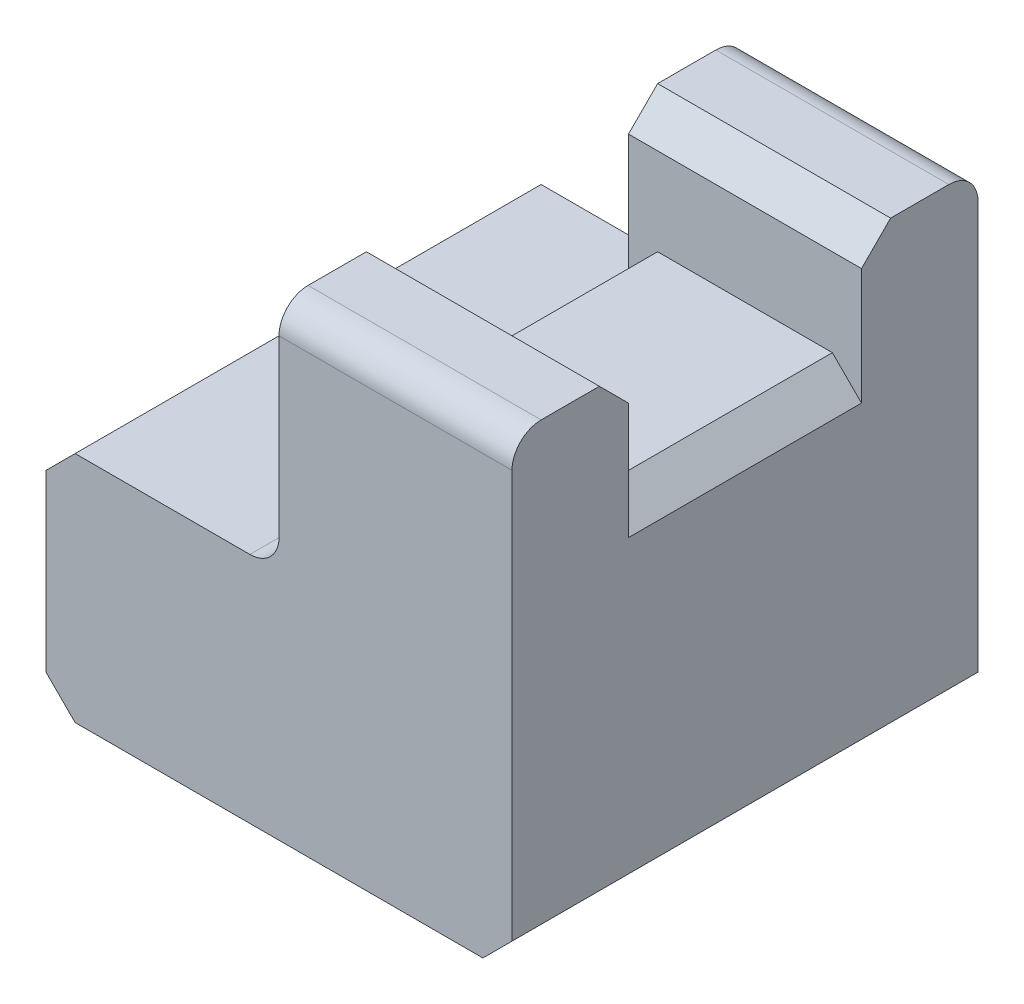
ISO-10303-21;
HEADER;
FILE_DESCRIPTION(('STEP AP214'),'2;1');
FILE_NAME('part.step','',(''),(''),'','','');
FILE_SCHEMA(('AUTOMOTIVE_DESIGN { 1 0 10303 214 1 1 1 1 }'));
ENDSEC;
DATA;
#1=APPLICATION_CONTEXT('core data for automotive mechanical design processes');
#2=APPLICATION_PROTOCOL_DEFINITION('international standard','automotive_design',2000,#1);
#3=PRODUCT_CONTEXT('',#1,'mechanical');
#4=PRODUCT('Part','Part','',(#3));
#5=PRODUCT_RELATED_PRODUCT_CATEGORY('part','',(#4));
#6=PRODUCT_DEFINITION_FORMATION('','',#4);
#7=PRODUCT_DEFINITION_CONTEXT('part definition',#1,'design');
#8=PRODUCT_DEFINITION('design','',#6,#7);
#9=PRODUCT_DEFINITION_SHAPE('','',#8);
#10=(LENGTH_UNIT() NAMED_UNIT(*) SI_UNIT(.MILLI.,.METRE.));
#11=(NAMED_UNIT(*) PLANE_ANGLE_UNIT() SI_UNIT($,.RADIAN.));
#12=(NAMED_UNIT(*) SI_UNIT($,.STERADIAN.) SOLID_ANGLE_UNIT());
#13=UNCERTAINTY_MEASURE_WITH_UNIT(LENGTH_MEASURE(1.E-05),#10,'distance_accuracy_value','');
#14=(GEOMETRIC_REPRESENTATION_CONTEXT(3) GLOBAL_UNCERTAINTY_ASSIGNED_CONTEXT((#13)) GLOBAL_UNIT_ASSIGNED_CONTEXT((#10,
#11,#12)) REPRESENTATION_CONTEXT('',''));
#15=CARTESIAN_POINT('',(0.,0.,0.));
#16=DIRECTION('',(0.,0.,1.));
#17=DIRECTION('',(1.,0.,0.));
#18=AXIS2_PLACEMENT_3D('',#15,#16,#17);
#19=CARTESIAN_POINT('',(-40.,80.,80.));
#20=DIRECTION('',(0.,-1.,0.));
#21=DIRECTION('',(0.,0.,-1.));
#22=AXIS2_PLACEMENT_3D('',#19,#20,#21);
#23=PLANE('',#22);
#24=DIRECTION('',(0.,0.,-1.));
#25=VECTOR('',#24,1.);
#26=CARTESIAN_POINT('',(-40.,80.,80.));
#27=LINE('',#26,#25);
#28=CARTESIAN_POINT('',(-40.,80.,15.));
#29=VERTEX_POINT('',#28);
#30=CARTESIAN_POINT('',(-40.,80.,5.));
#31=VERTEX_POINT('',#30);
#32=EDGE_CURVE('E168',#29,#31,#27,.T.);
#33=ORIENTED_EDGE('',*,*,#32,.F.);
#34=DIRECTION('',(1.,0.,0.));
#35=VECTOR('',#34,1.);
#36=CARTESIAN_POINT('',(-40.,80.,15.));
#37=LINE('',#36,#35);
#38=CARTESIAN_POINT('',(0.,80.,15.));
#39=VERTEX_POINT('',#38);
#40=EDGE_CURVE('E216',#29,#39,#37,.T.);
#41=ORIENTED_EDGE('',*,*,#40,.T.);
#42=DIRECTION('',(0.,0.,-1.));
#43=VECTOR('',#42,1.);
#44=CARTESIAN_POINT('',(0.,80.,80.));
#45=LINE('',#44,#43);
#46=CARTESIAN_POINT('',(0.,80.,5.));
#47=VERTEX_POINT('',#46);
#48=EDGE_CURVE('E196',#39,#47,#45,.T.);
#49=ORIENTED_EDGE('',*,*,#48,.T.);
#50=DIRECTION('',(-1.,0.,0.));
#51=VECTOR('',#50,1.);
#52=CARTESIAN_POINT('',(-40.,80.,5.));
#53=LINE('',#52,#51);
#54=EDGE_CURVE('E190',#47,#31,#53,.T.);
#55=ORIENTED_EDGE('',*,*,#54,.T.);
#56=EDGE_LOOP('',(#33,#41,#49,#55));
#57=FACE_BOUND('',#56,.T.);
#58=ADVANCED_FACE('F33',(#57),#23,.F.);
#59=CARTESIAN_POINT('',(0.,80.,80.));
#60=DIRECTION('',(-1.,0.,0.));
#61=DIRECTION('',(0.,-1.,0.));
#62=AXIS2_PLACEMENT_3D('',#59,#60,#61);
#63=PLANE('',#62);
#64=DIRECTION('',(0.,1.,0.));
#65=VECTOR('',#64,1.);
#66=CARTESIAN_POINT('',(0.,60.,20.));
#67=LINE('',#66,#65);
#68=CARTESIAN_POINT('',(0.,55.,20.));
#69=VERTEX_POINT('',#68);
#70=CARTESIAN_POINT('',(0.,75.,20.));
#71=VERTEX_POINT('',#70);
#72=EDGE_CURVE('E295',#69,#71,#67,.T.);
#73=ORIENTED_EDGE('',*,*,#72,.F.);
#74=DIRECTION('',(0.,0.,1.));
#75=VECTOR('',#74,1.);
#76=CARTESIAN_POINT('',(0.,55.,80.));
#77=LINE('',#76,#75);
#78=CARTESIAN_POINT('',(0.,55.,60.));
#79=VERTEX_POINT('',#78);
#80=EDGE_CURVE('E273',#69,#79,#77,.T.);
#81=ORIENTED_EDGE('',*,*,#80,.T.);
#82=DIRECTION('',(0.,-1.,0.));
#83=VECTOR('',#82,1.);
#84=CARTESIAN_POINT('',(0.,80.,60.));
#85=LINE('',#84,#83);
#86=CARTESIAN_POINT('',(0.,75.,60.));
#87=VERTEX_POINT('',#86);
#88=EDGE_CURVE('E300',#87,#79,#85,.T.);
#89=ORIENTED_EDGE('',*,*,#88,.F.);
#90=DIRECTION('',(0.,-0.707106781186546,-0.707106781186549));
#91=VECTOR('',#90,1.);
#92=CARTESIAN_POINT('',(0.,75.,60.));
#93=LINE('',#92,#91);
#94=CARTESIAN_POINT('',(0.,80.,65.0000000000001));
#95=VERTEX_POINT('',#94);
#96=EDGE_CURVE('E218',#87,#95,#93,.F.);
#97=ORIENTED_EDGE('',*,*,#96,.T.);
#98=CARTESIAN_POINT('',(0.,80.,75.));
#99=VERTEX_POINT('',#98);
#100=EDGE_CURVE('E327',#99,#95,#45,.T.);
#101=ORIENTED_EDGE('',*,*,#100,.F.);
#102=CARTESIAN_POINT('',(0.,75.,75.));
#103=DIRECTION('',(-1.,0.,0.));
#104=DIRECTION('',(0.,-1.,0.));
#105=AXIS2_PLACEMENT_3D('',#102,#103,#104);
#106=CIRCLE('',#105,5.);
#107=CARTESIAN_POINT('',(0.,75.,80.));
#108=VERTEX_POINT('',#107);
#109=EDGE_CURVE('E206',#99,#108,#106,.F.);
#110=ORIENTED_EDGE('',*,*,#109,.T.);
#111=DIRECTION('',(0.,1.,0.));
#112=VECTOR('',#111,1.);
#113=CARTESIAN_POINT('',(0.,80.,80.));
#114=LINE('',#113,#112);
#115=CARTESIAN_POINT('',(0.,4.99999999999999,80.));
#116=VERTEX_POINT('',#115);
#117=EDGE_CURVE('E303',#116,#108,#114,.T.);
#118=ORIENTED_EDGE('',*,*,#117,.F.);
#119=DIRECTION('',(0.,0.,-1.));
#120=VECTOR('',#119,1.);
#121=CARTESIAN_POINT('',(0.,4.99999999999999,80.));
#122=LINE('',#121,#120);
#123=CARTESIAN_POINT('',(0.,4.99999999999999,0.));
#124=VERTEX_POINT('',#123);
#125=EDGE_CURVE('E261',#116,#124,#122,.T.);
#126=ORIENTED_EDGE('',*,*,#125,.T.);
#127=DIRECTION('',(0.,1.,0.));
#128=VECTOR('',#127,1.);
#129=CARTESIAN_POINT('',(0.,80.,0.));
#130=LINE('',#129,#128);
#131=CARTESIAN_POINT('',(0.,75.,0.));
#132=VERTEX_POINT('',#131);
#133=EDGE_CURVE('E297',#124,#132,#130,.T.);
#134=ORIENTED_EDGE('',*,*,#133,.T.);
#135=CARTESIAN_POINT('',(0.,75.,5.));
#136=DIRECTION('',(-1.,0.,0.));
#137=DIRECTION('',(0.,-1.,0.));
#138=AXIS2_PLACEMENT_3D('',#135,#136,#137);
#139=CIRCLE('',#138,5.);
#140=EDGE_CURVE('E209',#132,#47,#139,.F.);
#141=ORIENTED_EDGE('',*,*,#140,.T.);
#142=ORIENTED_EDGE('',*,*,#48,.F.);
#143=DIRECTION('',(0.,0.707106781186549,-0.707106781186547));
#144=VECTOR('',#143,1.);
#145=CARTESIAN_POINT('',(0.,80.,15.));
#146=LINE('',#145,#144);
#147=EDGE_CURVE('E220',#39,#71,#146,.F.);
#148=ORIENTED_EDGE('',*,*,#147,.T.);
#149=EDGE_LOOP('',(#73,#81,#89,#97,#101,#110,#118,#126,#134,#141,#142,#148));
#150=FACE_BOUND('',#149,.T.);
#151=ADVANCED_FACE('F345',(#150),#63,.F.);
#152=ORIENTED_EDGE('',*,*,#100,.T.);
#153=DIRECTION('',(-1.,0.,0.));
#154=VECTOR('',#153,1.);
#155=CARTESIAN_POINT('',(-40.,80.,65.0000000000001));
#156=LINE('',#155,#154);
#157=CARTESIAN_POINT('',(-40.,80.,65.0000000000001));
#158=VERTEX_POINT('',#157);
#159=EDGE_CURVE('E230',#95,#158,#156,.T.);
#160=ORIENTED_EDGE('',*,*,#159,.T.);
#161=CARTESIAN_POINT('',(-40.,80.,75.));
#162=VERTEX_POINT('',#161);
#163=EDGE_CURVE('E182',#162,#158,#27,.T.);
#164=ORIENTED_EDGE('',*,*,#163,.F.);
#165=DIRECTION('',(-1.,0.,0.));
#166=VECTOR('',#165,1.);
#167=CARTESIAN_POINT('',(-40.,80.,75.));
#168=LINE('',#167,#166);
#169=EDGE_CURVE('E214',#162,#99,#168,.F.);
#170=ORIENTED_EDGE('',*,*,#169,.T.);
#171=EDGE_LOOP('',(#152,#160,#164,#170));
#172=FACE_BOUND('',#171,.T.);
#173=ADVANCED_FACE('F332',(#172),#23,.F.);
#174=CARTESIAN_POINT('',(-40.,40.,80.));
#175=DIRECTION('',(1.,0.,0.));
#176=DIRECTION('',(0.,0.,-1.));
#177=AXIS2_PLACEMENT_3D('',#174,#175,#176);
#178=PLANE('',#177);
#179=DIRECTION('',(0.,0.,-1.));
#180=VECTOR('',#179,1.);
#181=CARTESIAN_POINT('',(-40.,55.,80.));
#182=LINE('',#181,#180);
#183=CARTESIAN_POINT('',(-40.,55.,60.));
#184=VERTEX_POINT('',#183);
#185=CARTESIAN_POINT('',(-40.,55.,20.));
#186=VERTEX_POINT('',#185);
#187=EDGE_CURVE('E282',#184,#186,#182,.T.);
#188=ORIENTED_EDGE('',*,*,#187,.T.);
#189=DIRECTION('',(0.,1.,0.));
#190=VECTOR('',#189,1.);
#191=CARTESIAN_POINT('',(-40.,40.,20.));
#192=LINE('',#191,#190);
#193=CARTESIAN_POINT('',(-40.,75.,20.));
#194=VERTEX_POINT('',#193);
#195=EDGE_CURVE('E198',#186,#194,#192,.T.);
#196=ORIENTED_EDGE('',*,*,#195,.T.);
#197=DIRECTION('',(0.,-0.707106781186549,0.707106781186547));
#198=VECTOR('',#197,1.);
#199=CARTESIAN_POINT('',(-40.,80.,15.));
#200=LINE('',#199,#198);
#201=EDGE_CURVE('E177',#194,#29,#200,.F.);
#202=ORIENTED_EDGE('',*,*,#201,.T.);
#203=ORIENTED_EDGE('',*,*,#32,.T.);
#204=CARTESIAN_POINT('',(-40.,75.,5.));
#205=DIRECTION('',(1.,0.,0.));
#206=DIRECTION('',(0.,0.,-1.));
#207=AXIS2_PLACEMENT_3D('',#204,#205,#206);
#208=CIRCLE('',#207,5.);
#209=CARTESIAN_POINT('',(-40.,75.,0.));
#210=VERTEX_POINT('',#209);
#211=EDGE_CURVE('E173',#31,#210,#208,.F.);
#212=ORIENTED_EDGE('',*,*,#211,.T.);
#213=DIRECTION('',(0.,-1.,0.));
#214=VECTOR('',#213,1.);
#215=CARTESIAN_POINT('',(-40.,40.,0.));
#216=LINE('',#215,#214);
#217=CARTESIAN_POINT('',(-40.,45.,0.));
#218=VERTEX_POINT('',#217);
#219=EDGE_CURVE('E317',#210,#218,#216,.T.);
#220=ORIENTED_EDGE('',*,*,#219,.T.);
#221=DIRECTION('',(0.,0.,-1.));
#222=VECTOR('',#221,1.);
#223=CARTESIAN_POINT('',(-40.,45.,80.));
#224=LINE('',#223,#222);
#225=CARTESIAN_POINT('',(-40.,45.,80.));
#226=VERTEX_POINT('',#225);
#227=EDGE_CURVE('E246',#218,#226,#224,.F.);
#228=ORIENTED_EDGE('',*,*,#227,.T.);
#229=DIRECTION('',(0.,-1.,0.));
#230=VECTOR('',#229,1.);
#231=CARTESIAN_POINT('',(-40.,40.,80.));
#232=LINE('',#231,#230);
#233=CARTESIAN_POINT('',(-40.,75.,80.));
#234=VERTEX_POINT('',#233);
#235=EDGE_CURVE('E305',#234,#226,#232,.T.);
#236=ORIENTED_EDGE('',*,*,#235,.F.);
#237=CARTESIAN_POINT('',(-40.,75.,75.));
#238=DIRECTION('',(1.,0.,0.));
#239=DIRECTION('',(0.,0.,-1.));
#240=AXIS2_PLACEMENT_3D('',#237,#238,#239);
#241=CIRCLE('',#240,5.);
#242=EDGE_CURVE('E193',#234,#162,#241,.F.);
#243=ORIENTED_EDGE('',*,*,#242,.T.);
#244=ORIENTED_EDGE('',*,*,#163,.T.);
#245=DIRECTION('',(0.,0.707106781186546,0.707106781186549));
#246=VECTOR('',#245,1.);
#247=CARTESIAN_POINT('',(-40.,75.,60.));
#248=LINE('',#247,#246);
#249=CARTESIAN_POINT('',(-40.,75.,60.));
#250=VERTEX_POINT('',#249);
#251=EDGE_CURVE('E224',#158,#250,#248,.F.);
#252=ORIENTED_EDGE('',*,*,#251,.T.);
#253=DIRECTION('',(0.,-1.,0.));
#254=VECTOR('',#253,1.);
#255=CARTESIAN_POINT('',(-40.,40.,60.));
#256=LINE('',#255,#254);
#257=EDGE_CURVE('E201',#250,#184,#256,.T.);
#258=ORIENTED_EDGE('',*,*,#257,.T.);
#259=EDGE_LOOP('',(#188,#196,#202,#203,#212,#220,#228,#236,#243,#244,#252,#258));
#260=FACE_BOUND('',#259,.T.);
#261=ADVANCED_FACE('F171',(#260),#178,.F.);
#262=CARTESIAN_POINT('',(-80.,40.,80.));
#263=DIRECTION('',(0.,-1.,0.));
#264=DIRECTION('',(0.,0.,-1.));
#265=AXIS2_PLACEMENT_3D('',#262,#263,#264);
#266=PLANE('',#265);
#267=CARTESIAN_POINT('',(-60.,40.,40.));
#268=DIRECTION('',(0.,1.,0.));
#269=DIRECTION('',(0.,0.,1.));
#270=AXIS2_PLACEMENT_3D('',#267,#268,#269);
#271=CIRCLE('',#270,10.);
#272=CARTESIAN_POINT('',(-60.,40.,50.));
#273=VERTEX_POINT('',#272);
#274=EDGE_CURVE('E533',#273,#273,#271,.T.);
#275=ORIENTED_EDGE('',*,*,#274,.F.);
#276=EDGE_LOOP('',(#275));
#277=FACE_BOUND('',#276,.T.);
#278=DIRECTION('',(-1.,0.,0.));
#279=VECTOR('',#278,1.);
#280=CARTESIAN_POINT('',(-80.,40.,80.));
#281=LINE('',#280,#279);
#282=CARTESIAN_POINT('',(-45.,40.,80.));
#283=VERTEX_POINT('',#282);
#284=CARTESIAN_POINT('',(-75.,40.,80.));
#285=VERTEX_POINT('',#284);
#286=EDGE_CURVE('E309',#283,#285,#281,.T.);
#287=ORIENTED_EDGE('',*,*,#286,.F.);
#288=DIRECTION('',(0.,0.,-1.));
#289=VECTOR('',#288,1.);
#290=CARTESIAN_POINT('',(-45.,40.,0.));
#291=LINE('',#290,#289);
#292=CARTESIAN_POINT('',(-45.,40.,0.));
#293=VERTEX_POINT('',#292);
#294=EDGE_CURVE('E243',#283,#293,#291,.T.);
#295=ORIENTED_EDGE('',*,*,#294,.T.);
#296=DIRECTION('',(-1.,0.,0.));
#297=VECTOR('',#296,1.);
#298=CARTESIAN_POINT('',(-80.,40.,0.));
#299=LINE('',#298,#297);
#300=CARTESIAN_POINT('',(-75.,40.,0.));
#301=VERTEX_POINT('',#300);
#302=EDGE_CURVE('E319',#293,#301,#299,.T.);
#303=ORIENTED_EDGE('',*,*,#302,.T.);
#304=DIRECTION('',(0.,0.,1.));
#305=VECTOR('',#304,1.);
#306=CARTESIAN_POINT('',(-75.,40.,80.));
#307=LINE('',#306,#305);
#308=EDGE_CURVE('E238',#301,#285,#307,.T.);
#309=ORIENTED_EDGE('',*,*,#308,.T.);
#310=EDGE_LOOP('',(#287,#295,#303,#309));
#311=FACE_BOUND('',#310,.T.);
#312=ADVANCED_FACE('F376',(#277,#311),#266,.F.);
#313=CARTESIAN_POINT('',(-80.,0.,80.));
#314=DIRECTION('',(1.,0.,0.));
#315=DIRECTION('',(0.,0.,-1.));
#316=AXIS2_PLACEMENT_3D('',#313,#314,#315);
#317=PLANE('',#316);
#318=DIRECTION('',(0.,-1.,0.));
#319=VECTOR('',#318,1.);
#320=CARTESIAN_POINT('',(-80.,0.,0.));
#321=LINE('',#320,#319);
#322=CARTESIAN_POINT('',(-80.,35.,0.));
#323=VERTEX_POINT('',#322);
#324=CARTESIAN_POINT('',(-80.,5.00000000000005,0.));
#325=VERTEX_POINT('',#324);
#326=EDGE_CURVE('E321',#323,#325,#321,.T.);
#327=ORIENTED_EDGE('',*,*,#326,.T.);
#328=DIRECTION('',(0.,0.,1.));
#329=VECTOR('',#328,1.);
#330=CARTESIAN_POINT('',(-80.,5.00000000000005,80.));
#331=LINE('',#330,#329);
#332=CARTESIAN_POINT('',(-80.,5.00000000000005,80.));
#333=VERTEX_POINT('',#332);
#334=EDGE_CURVE('E257',#325,#333,#331,.T.);
#335=ORIENTED_EDGE('',*,*,#334,.T.);
#336=DIRECTION('',(0.,-1.,0.));
#337=VECTOR('',#336,1.);
#338=CARTESIAN_POINT('',(-80.,0.,80.));
#339=LINE('',#338,#337);
#340=CARTESIAN_POINT('',(-80.,35.,80.));
#341=VERTEX_POINT('',#340);
#342=EDGE_CURVE('E311',#341,#333,#339,.T.);
#343=ORIENTED_EDGE('',*,*,#342,.F.);
#344=DIRECTION('',(0.,0.,-1.));
#345=VECTOR('',#344,1.);
#346=CARTESIAN_POINT('',(-80.,35.,80.));
#347=LINE('',#346,#345);
#348=EDGE_CURVE('E232',#341,#323,#347,.T.);
#349=ORIENTED_EDGE('',*,*,#348,.T.);
#350=EDGE_LOOP('',(#327,#335,#343,#349));
#351=FACE_BOUND('',#350,.T.);
#352=ADVANCED_FACE('F366',(#351),#317,.F.);
#353=CARTESIAN_POINT('',(0.,0.,80.));
#354=DIRECTION('',(0.,1.,0.));
#355=DIRECTION('',(0.,0.,1.));
#356=AXIS2_PLACEMENT_3D('',#353,#354,#355);
#357=PLANE('',#356);
#358=CARTESIAN_POINT('',(-60.,0.,40.));
#359=DIRECTION('',(0.,1.,0.));
#360=DIRECTION('',(0.,0.,1.));
#361=AXIS2_PLACEMENT_3D('',#358,#359,#360);
#362=CIRCLE('',#361,10.);
#363=CARTESIAN_POINT('',(-60.,0.,50.));
#364=VERTEX_POINT('',#363);
#365=EDGE_CURVE('E530',#364,#364,#362,.T.);
#366=ORIENTED_EDGE('',*,*,#365,.T.);
#367=EDGE_LOOP('',(#366));
#368=FACE_BOUND('',#367,.T.);
#369=DIRECTION('',(1.,0.,0.));
#370=VECTOR('',#369,1.);
#371=CARTESIAN_POINT('',(0.,0.,0.));
#372=LINE('',#371,#370);
#373=CARTESIAN_POINT('',(-75.,0.,0.));
#374=VERTEX_POINT('',#373);
#375=CARTESIAN_POINT('',(-5.,0.,0.));
#376=VERTEX_POINT('',#375);
#377=EDGE_CURVE('E306',#374,#376,#372,.T.);
#378=ORIENTED_EDGE('',*,*,#377,.T.);
#379=DIRECTION('',(0.,0.,1.));
#380=VECTOR('',#379,1.);
#381=CARTESIAN_POINT('',(-5.,0.,80.));
#382=LINE('',#381,#380);
#383=CARTESIAN_POINT('',(-5.,0.,80.));
#384=VERTEX_POINT('',#383);
#385=EDGE_CURVE('E266',#376,#384,#382,.T.);
#386=ORIENTED_EDGE('',*,*,#385,.T.);
#387=DIRECTION('',(1.,0.,0.));
#388=VECTOR('',#387,1.);
#389=CARTESIAN_POINT('',(0.,0.,80.));
#390=LINE('',#389,#388);
#391=CARTESIAN_POINT('',(-75.,0.,80.));
#392=VERTEX_POINT('',#391);
#393=EDGE_CURVE('E183',#392,#384,#390,.T.);
#394=ORIENTED_EDGE('',*,*,#393,.F.);
#395=DIRECTION('',(0.,0.,-1.));
#396=VECTOR('',#395,1.);
#397=CARTESIAN_POINT('',(-75.,0.,80.));
#398=LINE('',#397,#396);
#399=EDGE_CURVE('E252',#392,#374,#398,.T.);
#400=ORIENTED_EDGE('',*,*,#399,.T.);
#401=EDGE_LOOP('',(#378,#386,#394,#400));
#402=FACE_BOUND('',#401,.T.);
#403=ADVANCED_FACE('F357',(#368,#402),#357,.F.);
#404=CARTESIAN_POINT('',(0.,0.,80.));
#405=DIRECTION('',(0.,0.,-1.));
#406=DIRECTION('',(-1.,0.,0.));
#407=AXIS2_PLACEMENT_3D('',#404,#405,#406);
#408=PLANE('',#407);
#409=ORIENTED_EDGE('',*,*,#393,.T.);
#410=DIRECTION('',(-0.707106781186549,-0.707106781186547,0.));
#411=VECTOR('',#410,1.);
#412=CARTESIAN_POINT('',(0.,4.99999999999999,80.));
#413=LINE('',#412,#411);
#414=EDGE_CURVE('E268',#384,#116,#413,.F.);
#415=ORIENTED_EDGE('',*,*,#414,.T.);
#416=ORIENTED_EDGE('',*,*,#117,.T.);
#417=DIRECTION('',(-1.,0.,0.));
#418=VECTOR('',#417,1.);
#419=CARTESIAN_POINT('',(0.,75.,80.));
#420=LINE('',#419,#418);
#421=EDGE_CURVE('E211',#108,#234,#420,.T.);
#422=ORIENTED_EDGE('',*,*,#421,.T.);
#423=ORIENTED_EDGE('',*,*,#235,.T.);
#424=CARTESIAN_POINT('',(-45.,45.,80.));
#425=DIRECTION('',(0.,0.,-1.));
#426=DIRECTION('',(-1.,0.,0.));
#427=AXIS2_PLACEMENT_3D('',#424,#425,#426);
#428=CIRCLE('',#427,5.);
#429=EDGE_CURVE('E250',#226,#283,#428,.T.);
#430=ORIENTED_EDGE('',*,*,#429,.T.);
#431=ORIENTED_EDGE('',*,*,#286,.T.);
#432=DIRECTION('',(0.707106781186549,0.707106781186546,0.));
#433=VECTOR('',#432,1.);
#434=CARTESIAN_POINT('',(-80.,35.,80.));
#435=LINE('',#434,#433);
#436=EDGE_CURVE('E241',#285,#341,#435,.F.);
#437=ORIENTED_EDGE('',*,*,#436,.T.);
#438=ORIENTED_EDGE('',*,*,#342,.T.);
#439=DIRECTION('',(-0.707106781186547,0.707106781186549,0.));
#440=VECTOR('',#439,1.);
#441=CARTESIAN_POINT('',(-75.,0.,80.));
#442=LINE('',#441,#440);
#443=EDGE_CURVE('E259',#333,#392,#442,.F.);
#444=ORIENTED_EDGE('',*,*,#443,.T.);
#445=EDGE_LOOP('',(#409,#415,#416,#422,#423,#430,#431,#437,#438,#444));
#446=FACE_BOUND('',#445,.T.);
#447=ADVANCED_FACE('F382',(#446),#408,.F.);
#448=CARTESIAN_POINT('',(0.,0.,0.));
#449=DIRECTION('',(0.,0.,-1.));
#450=DIRECTION('',(-1.,0.,0.));
#451=AXIS2_PLACEMENT_3D('',#448,#449,#450);
#452=PLANE('',#451);
#453=ORIENTED_EDGE('',*,*,#133,.F.);
#454=DIRECTION('',(0.707106781186549,0.707106781186547,0.));
#455=VECTOR('',#454,1.);
#456=CARTESIAN_POINT('',(-2.5,2.5,0.));
#457=LINE('',#456,#455);
#458=EDGE_CURVE('E264',#124,#376,#457,.F.);
#459=ORIENTED_EDGE('',*,*,#458,.T.);
#460=ORIENTED_EDGE('',*,*,#377,.F.);
#461=DIRECTION('',(0.707106781186547,-0.707106781186549,0.));
#462=VECTOR('',#461,1.);
#463=CARTESIAN_POINT('',(-37.5000000000001,-37.5,0.));
#464=LINE('',#463,#462);
#465=EDGE_CURVE('E255',#374,#325,#464,.F.);
#466=ORIENTED_EDGE('',*,*,#465,.T.);
#467=ORIENTED_EDGE('',*,*,#326,.F.);
#468=DIRECTION('',(-0.707106781186549,-0.707106781186546,0.));
#469=VECTOR('',#468,1.);
#470=CARTESIAN_POINT('',(-57.4999999999998,57.5000000000001,0.));
#471=LINE('',#470,#469);
#472=EDGE_CURVE('E235',#323,#301,#471,.F.);
#473=ORIENTED_EDGE('',*,*,#472,.T.);
#474=ORIENTED_EDGE('',*,*,#302,.F.);
#475=CARTESIAN_POINT('',(-45.,45.,0.));
#476=DIRECTION('',(0.,0.,-1.));
#477=DIRECTION('',(-1.,0.,0.));
#478=AXIS2_PLACEMENT_3D('',#475,#476,#477);
#479=CIRCLE('',#478,5.);
#480=EDGE_CURVE('E248',#293,#218,#479,.F.);
#481=ORIENTED_EDGE('',*,*,#480,.T.);
#482=ORIENTED_EDGE('',*,*,#219,.F.);
#483=DIRECTION('',(-1.,0.,0.));
#484=VECTOR('',#483,1.);
#485=CARTESIAN_POINT('',(0.,75.,0.));
#486=LINE('',#485,#484);
#487=EDGE_CURVE('E192',#210,#132,#486,.F.);
#488=ORIENTED_EDGE('',*,*,#487,.T.);
#489=EDGE_LOOP('',(#453,#459,#460,#466,#467,#473,#474,#481,#482,#488));
#490=FACE_BOUND('',#489,.T.);
#491=ADVANCED_FACE('F355',(#490),#452,.T.);
#492=CARTESIAN_POINT('',(-80.,60.,20.));
#493=DIRECTION('',(0.,0.,-1.));
#494=DIRECTION('',(0.,1.,0.));
#495=AXIS2_PLACEMENT_3D('',#492,#493,#494);
#496=PLANE('',#495);
#497=ORIENTED_EDGE('',*,*,#72,.T.);
#498=DIRECTION('',(-1.,0.,0.));
#499=VECTOR('',#498,1.);
#500=CARTESIAN_POINT('',(-80.,75.,20.));
#501=LINE('',#500,#499);
#502=EDGE_CURVE('E222',#71,#194,#501,.T.);
#503=ORIENTED_EDGE('',*,*,#502,.T.);
#504=ORIENTED_EDGE('',*,*,#195,.F.);
#505=DIRECTION('',(-0.707106781186549,-0.707106781186547,0.));
#506=VECTOR('',#505,1.);
#507=CARTESIAN_POINT('',(-57.5000000000001,37.5,20.));
#508=LINE('',#507,#506);
#509=CARTESIAN_POINT('',(-35.,60.,20.));
#510=VERTEX_POINT('',#509);
#511=EDGE_CURVE('E41',#186,#510,#508,.F.);
#512=ORIENTED_EDGE('',*,*,#511,.T.);
#513=DIRECTION('',(1.,0.,0.));
#514=VECTOR('',#513,1.);
#515=CARTESIAN_POINT('',(-80.,60.,20.));
#516=LINE('',#515,#514);
#517=CARTESIAN_POINT('',(-4.99999999999999,60.,20.));
#518=VERTEX_POINT('',#517);
#519=EDGE_CURVE('E294',#510,#518,#516,.T.);
#520=ORIENTED_EDGE('',*,*,#519,.T.);
#521=DIRECTION('',(-0.707106781186547,0.707106781186549,0.));
#522=VECTOR('',#521,1.);
#523=CARTESIAN_POINT('',(-42.4999999999999,97.5,20.));
#524=LINE('',#523,#522);
#525=EDGE_CURVE('E276',#518,#69,#524,.F.);
#526=ORIENTED_EDGE('',*,*,#525,.T.);
#527=EDGE_LOOP('',(#497,#503,#504,#512,#520,#526));
#528=FACE_BOUND('',#527,.T.);
#529=ADVANCED_FACE('F389',(#528),#496,.F.);
#530=CARTESIAN_POINT('',(-80.,60.,60.));
#531=DIRECTION('',(0.,-1.,0.));
#532=DIRECTION('',(1.,0.,0.));
#533=AXIS2_PLACEMENT_3D('',#530,#531,#532);
#534=PLANE('',#533);
#535=ORIENTED_EDGE('',*,*,#519,.F.);
#536=DIRECTION('',(0.,0.,1.));
#537=VECTOR('',#536,1.);
#538=CARTESIAN_POINT('',(-35.,60.,60.));
#539=LINE('',#538,#537);
#540=CARTESIAN_POINT('',(-35.,60.,60.));
#541=VERTEX_POINT('',#540);
#542=EDGE_CURVE('E54',#510,#541,#539,.T.);
#543=ORIENTED_EDGE('',*,*,#542,.T.);
#544=DIRECTION('',(1.,0.,0.));
#545=VECTOR('',#544,1.);
#546=CARTESIAN_POINT('',(-80.,60.,60.));
#547=LINE('',#546,#545);
#548=CARTESIAN_POINT('',(-4.99999999999999,60.,60.));
#549=VERTEX_POINT('',#548);
#550=EDGE_CURVE('E291',#541,#549,#547,.T.);
#551=ORIENTED_EDGE('',*,*,#550,.T.);
#552=DIRECTION('',(0.,0.,-1.));
#553=VECTOR('',#552,1.);
#554=CARTESIAN_POINT('',(-4.99999999999999,60.,60.));
#555=LINE('',#554,#553);
#556=EDGE_CURVE('E270',#549,#518,#555,.T.);
#557=ORIENTED_EDGE('',*,*,#556,.T.);
#558=EDGE_LOOP('',(#535,#543,#551,#557));
#559=FACE_BOUND('',#558,.T.);
#560=ADVANCED_FACE('F460',(#559),#534,.F.);
#561=CARTESIAN_POINT('',(-80.,80.,60.));
#562=DIRECTION('',(0.,0.,1.));
#563=DIRECTION('',(1.,0.,0.));
#564=AXIS2_PLACEMENT_3D('',#561,#562,#563);
#565=PLANE('',#564);
#566=ORIENTED_EDGE('',*,*,#257,.F.);
#567=DIRECTION('',(1.,0.,0.));
#568=VECTOR('',#567,1.);
#569=CARTESIAN_POINT('',(-80.,75.,60.));
#570=LINE('',#569,#568);
#571=EDGE_CURVE('E227',#250,#87,#570,.T.);
#572=ORIENTED_EDGE('',*,*,#571,.T.);
#573=ORIENTED_EDGE('',*,*,#88,.T.);
#574=DIRECTION('',(0.707106781186547,-0.707106781186549,0.));
#575=VECTOR('',#574,1.);
#576=CARTESIAN_POINT('',(-52.4999999999999,107.5,60.));
#577=LINE('',#576,#575);
#578=EDGE_CURVE('E279',#79,#549,#577,.F.);
#579=ORIENTED_EDGE('',*,*,#578,.T.);
#580=ORIENTED_EDGE('',*,*,#550,.F.);
#581=DIRECTION('',(0.707106781186549,0.707106781186547,0.));
#582=VECTOR('',#581,1.);
#583=CARTESIAN_POINT('',(-47.5000000000001,47.5,60.));
#584=LINE('',#583,#582);
#585=EDGE_CURVE('E11',#541,#184,#584,.F.);
#586=ORIENTED_EDGE('',*,*,#585,.T.);
#587=EDGE_LOOP('',(#566,#572,#573,#579,#580,#586));
#588=FACE_BOUND('',#587,.T.);
#589=ADVANCED_FACE('F289',(#588),#565,.F.);
#590=CARTESIAN_POINT('',(-40.,75.,5.));
#591=DIRECTION('',(1.,0.,0.));
#592=DIRECTION('',(0.,0.,-1.));
#593=AXIS2_PLACEMENT_3D('',#590,#591,#592);
#594=CYLINDRICAL_SURFACE('',#593,5.);
#595=ORIENTED_EDGE('',*,*,#140,.F.);
#596=ORIENTED_EDGE('',*,*,#487,.F.);
#597=ORIENTED_EDGE('',*,*,#211,.F.);
#598=ORIENTED_EDGE('',*,*,#54,.F.);
#599=EDGE_LOOP('',(#595,#596,#597,#598));
#600=FACE_BOUND('',#599,.T.);
#601=ADVANCED_FACE('F189',(#600),#594,.T.);
#602=CARTESIAN_POINT('',(0.,75.,75.));
#603=DIRECTION('',(-1.,0.,0.));
#604=DIRECTION('',(0.,0.,1.));
#605=AXIS2_PLACEMENT_3D('',#602,#603,#604);
#606=CYLINDRICAL_SURFACE('',#605,5.);
#607=ORIENTED_EDGE('',*,*,#109,.F.);
#608=ORIENTED_EDGE('',*,*,#169,.F.);
#609=ORIENTED_EDGE('',*,*,#242,.F.);
#610=ORIENTED_EDGE('',*,*,#421,.F.);
#611=EDGE_LOOP('',(#607,#608,#609,#610));
#612=FACE_BOUND('',#611,.T.);
#613=ADVANCED_FACE('F342',(#612),#606,.T.);
#614=CARTESIAN_POINT('',(-40.,80.,15.));
#615=DIRECTION('',(0.,-0.707106781186546,-0.707106781186548));
#616=DIRECTION('',(1.,0.,0.));
#617=AXIS2_PLACEMENT_3D('',#614,#615,#616);
#618=PLANE('',#617);
#619=ORIENTED_EDGE('',*,*,#201,.F.);
#620=ORIENTED_EDGE('',*,*,#502,.F.);
#621=ORIENTED_EDGE('',*,*,#147,.F.);
#622=ORIENTED_EDGE('',*,*,#40,.F.);
#623=EDGE_LOOP('',(#619,#620,#621,#622));
#624=FACE_BOUND('',#623,.T.);
#625=ADVANCED_FACE('F489',(#624),#618,.F.);
#626=CARTESIAN_POINT('',(-80.,75.,60.));
#627=DIRECTION('',(0.,-0.707106781186549,0.707106781186546));
#628=DIRECTION('',(1.,0.,0.));
#629=AXIS2_PLACEMENT_3D('',#626,#627,#628);
#630=PLANE('',#629);
#631=ORIENTED_EDGE('',*,*,#251,.F.);
#632=ORIENTED_EDGE('',*,*,#159,.F.);
#633=ORIENTED_EDGE('',*,*,#96,.F.);
#634=ORIENTED_EDGE('',*,*,#571,.F.);
#635=EDGE_LOOP('',(#631,#632,#633,#634));
#636=FACE_BOUND('',#635,.T.);
#637=ADVANCED_FACE('F339',(#636),#630,.F.);
#638=CARTESIAN_POINT('',(-60.,0.,40.));
#639=DIRECTION('',(0.,1.,0.));
#640=DIRECTION('',(0.,0.,1.));
#641=AXIS2_PLACEMENT_3D('',#638,#639,#640);
#642=CYLINDRICAL_SURFACE('',#641,10.);
#643=ORIENTED_EDGE('',*,*,#365,.F.);
#644=EDGE_LOOP('',(#643));
#645=FACE_BOUND('',#644,.T.);
#646=ORIENTED_EDGE('',*,*,#274,.T.);
#647=EDGE_LOOP('',(#646));
#648=FACE_BOUND('',#647,.T.);
#649=ADVANCED_FACE('F502',(#645,#648),#642,.F.);
#650=CARTESIAN_POINT('',(-80.,35.,80.));
#651=DIRECTION('',(0.707106781186545,-0.707106781186549,0.));
#652=DIRECTION('',(0.,0.,-1.));
#653=AXIS2_PLACEMENT_3D('',#650,#651,#652);
#654=PLANE('',#653);
#655=ORIENTED_EDGE('',*,*,#436,.F.);
#656=ORIENTED_EDGE('',*,*,#308,.F.);
#657=ORIENTED_EDGE('',*,*,#472,.F.);
#658=ORIENTED_EDGE('',*,*,#348,.F.);
#659=EDGE_LOOP('',(#655,#656,#657,#658));
#660=FACE_BOUND('',#659,.T.);
#661=ADVANCED_FACE('F371',(#660),#654,.F.);
#662=CARTESIAN_POINT('',(-45.,45.,80.));
#663=DIRECTION('',(0.,0.,1.));
#664=DIRECTION('',(1.,0.,0.));
#665=AXIS2_PLACEMENT_3D('',#662,#663,#664);
#666=CYLINDRICAL_SURFACE('',#665,5.);
#667=ORIENTED_EDGE('',*,*,#429,.F.);
#668=ORIENTED_EDGE('',*,*,#227,.F.);
#669=ORIENTED_EDGE('',*,*,#480,.F.);
#670=ORIENTED_EDGE('',*,*,#294,.F.);
#671=EDGE_LOOP('',(#667,#668,#669,#670));
#672=FACE_BOUND('',#671,.T.);
#673=ADVANCED_FACE('F380',(#672),#666,.F.);
#674=CARTESIAN_POINT('',(-75.,0.,80.));
#675=DIRECTION('',(0.707106781186549,0.707106781186547,0.));
#676=DIRECTION('',(0.,0.,-1.));
#677=AXIS2_PLACEMENT_3D('',#674,#675,#676);
#678=PLANE('',#677);
#679=ORIENTED_EDGE('',*,*,#443,.F.);
#680=ORIENTED_EDGE('',*,*,#334,.F.);
#681=ORIENTED_EDGE('',*,*,#465,.F.);
#682=ORIENTED_EDGE('',*,*,#399,.F.);
#683=EDGE_LOOP('',(#679,#680,#681,#682));
#684=FACE_BOUND('',#683,.T.);
#685=ADVANCED_FACE('F362',(#684),#678,.F.);
#686=CARTESIAN_POINT('',(0.,4.99999999999999,80.));
#687=DIRECTION('',(-0.707106781186546,0.707106781186548,0.));
#688=DIRECTION('',(0.,0.,-1.));
#689=AXIS2_PLACEMENT_3D('',#686,#687,#688);
#690=PLANE('',#689);
#691=ORIENTED_EDGE('',*,*,#414,.F.);
#692=ORIENTED_EDGE('',*,*,#385,.F.);
#693=ORIENTED_EDGE('',*,*,#458,.F.);
#694=ORIENTED_EDGE('',*,*,#125,.F.);
#695=EDGE_LOOP('',(#691,#692,#693,#694));
#696=FACE_BOUND('',#695,.T.);
#697=ADVANCED_FACE('F351',(#696),#690,.F.);
#698=CARTESIAN_POINT('',(-4.99999999999999,60.,60.));
#699=DIRECTION('',(-0.707106781186549,-0.707106781186547,0.));
#700=DIRECTION('',(0.,0.,-1.));
#701=AXIS2_PLACEMENT_3D('',#698,#699,#700);
#702=PLANE('',#701);
#703=ORIENTED_EDGE('',*,*,#578,.F.);
#704=ORIENTED_EDGE('',*,*,#80,.F.);
#705=ORIENTED_EDGE('',*,*,#525,.F.);
#706=ORIENTED_EDGE('',*,*,#556,.F.);
#707=EDGE_LOOP('',(#703,#704,#705,#706));
#708=FACE_BOUND('',#707,.T.);
#709=ADVANCED_FACE('F521',(#708),#702,.F.);
#710=CARTESIAN_POINT('',(-40.,55.,80.));
#711=DIRECTION('',(0.707106781186546,-0.707106781186548,0.));
#712=DIRECTION('',(0.,0.,-1.));
#713=AXIS2_PLACEMENT_3D('',#710,#711,#712);
#714=PLANE('',#713);
#715=ORIENTED_EDGE('',*,*,#585,.F.);
#716=ORIENTED_EDGE('',*,*,#542,.F.);
#717=ORIENTED_EDGE('',*,*,#511,.F.);
#718=ORIENTED_EDGE('',*,*,#187,.F.);
#719=EDGE_LOOP('',(#715,#716,#717,#718));
#720=FACE_BOUND('',#719,.T.);
#721=ADVANCED_FACE('F35',(#720),#714,.F.);
#722=CLOSED_SHELL('',(#58,#151,#173,#261,#312,#352,#403,#447,#491,#529,#560,#589,#601,#613,#625,
#637,#649,#661,#673,#685,#697,#709,#721));
#723=MANIFOLD_SOLID_BREP('B2',#722);
#724=ADVANCED_BREP_SHAPE_REPRESENTATION('',(#18,#723),#14);
#725=SHAPE_DEFINITION_REPRESENTATION(#9,#724);
ENDSEC;
END-ISO-10303-21;
